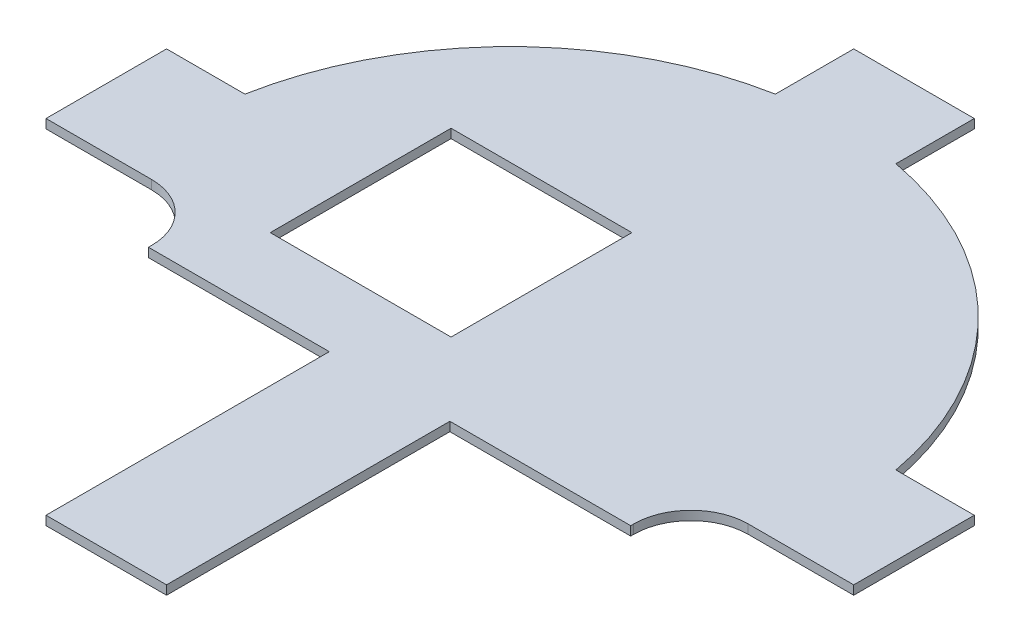
ISO-10303-21;
HEADER;
FILE_DESCRIPTION(('STEP AP214'),'2;1');
FILE_NAME('part.step','',(''),(''),'','','');
FILE_SCHEMA(('AUTOMOTIVE_DESIGN { 1 0 10303 214 1 1 1 1 }'));
ENDSEC;
DATA;
#1=APPLICATION_CONTEXT('core data for automotive mechanical design processes');
#2=APPLICATION_PROTOCOL_DEFINITION('international standard','automotive_design',2000,#1);
#3=PRODUCT_CONTEXT('',#1,'mechanical');
#4=PRODUCT('Part','Part','',(#3));
#5=PRODUCT_RELATED_PRODUCT_CATEGORY('part','',(#4));
#6=PRODUCT_DEFINITION_FORMATION('','',#4);
#7=PRODUCT_DEFINITION_CONTEXT('part definition',#1,'design');
#8=PRODUCT_DEFINITION('design','',#6,#7);
#9=PRODUCT_DEFINITION_SHAPE('','',#8);
#10=(LENGTH_UNIT() NAMED_UNIT(*) SI_UNIT(.MILLI.,.METRE.));
#11=(NAMED_UNIT(*) PLANE_ANGLE_UNIT() SI_UNIT($,.RADIAN.));
#12=(NAMED_UNIT(*) SI_UNIT($,.STERADIAN.) SOLID_ANGLE_UNIT());
#13=UNCERTAINTY_MEASURE_WITH_UNIT(LENGTH_MEASURE(1.E-05),#10,'distance_accuracy_value','');
#14=(GEOMETRIC_REPRESENTATION_CONTEXT(3) GLOBAL_UNCERTAINTY_ASSIGNED_CONTEXT((#13)) GLOBAL_UNIT_ASSIGNED_CONTEXT((#10,
#11,#12)) REPRESENTATION_CONTEXT('',''));
#15=CARTESIAN_POINT('',(0.,0.,0.));
#16=DIRECTION('',(0.,0.,1.));
#17=DIRECTION('',(1.,0.,0.));
#18=AXIS2_PLACEMENT_3D('',#15,#16,#17);
#19=CARTESIAN_POINT('',(-0.35449735449733,1.5,35.2134038800706));
#20=DIRECTION('',(0.,-1.,0.));
#21=DIRECTION('',(0.,0.,-1.));
#22=AXIS2_PLACEMENT_3D('',#19,#20,#21);
#23=CYLINDRICAL_SURFACE('',#22,54.9181208709839);
#24=CARTESIAN_POINT('',(-0.35449735449733,0.,35.2134038800706));
#25=DIRECTION('',(0.,1.,0.));
#26=DIRECTION('',(0.,0.,1.));
#27=AXIS2_PLACEMENT_3D('',#24,#25,#26);
#28=CIRCLE('',#27,54.9181208709839);
#29=CARTESIAN_POINT('',(9.64550264550266,0.,-18.7865961199294));
#30=VERTEX_POINT('',#29);
#31=CARTESIAN_POINT('',(53.6455026455027,0.,25.2134038800706));
#32=VERTEX_POINT('',#31);
#33=EDGE_CURVE('E227',#30,#32,#28,.F.);
#34=ORIENTED_EDGE('',*,*,#33,.F.);
#35=DIRECTION('',(0.,-1.,0.));
#36=VECTOR('',#35,1.);
#37=CARTESIAN_POINT('',(9.64550264550266,1.5,-18.7865961199294));
#38=LINE('',#37,#36);
#39=CARTESIAN_POINT('',(9.64550264550266,1.5,-18.7865961199294));
#40=VERTEX_POINT('',#39);
#41=EDGE_CURVE('E11',#40,#30,#38,.T.);
#42=ORIENTED_EDGE('',*,*,#41,.F.);
#43=CARTESIAN_POINT('',(-0.35449735449733,1.5,35.2134038800706));
#44=DIRECTION('',(0.,1.,0.));
#45=DIRECTION('',(0.,0.,1.));
#46=AXIS2_PLACEMENT_3D('',#43,#44,#45);
#47=CIRCLE('',#46,54.9181208709839);
#48=CARTESIAN_POINT('',(53.6455026455027,1.5,25.2134038800706));
#49=VERTEX_POINT('',#48);
#50=EDGE_CURVE('E231',#40,#49,#47,.F.);
#51=ORIENTED_EDGE('',*,*,#50,.T.);
#52=DIRECTION('',(0.,-1.,0.));
#53=VECTOR('',#52,1.);
#54=CARTESIAN_POINT('',(53.6455026455027,1.5,25.2134038800706));
#55=LINE('',#54,#53);
#56=EDGE_CURVE('E283',#49,#32,#55,.T.);
#57=ORIENTED_EDGE('',*,*,#56,.T.);
#58=EDGE_LOOP('',(#34,#42,#51,#57));
#59=FACE_BOUND('',#58,.T.);
#60=ADVANCED_FACE('F35',(#59),#23,.T.);
#61=CARTESIAN_POINT('',(9.64550264550266,1.5,0.));
#62=DIRECTION('',(1.,0.,0.));
#63=DIRECTION('',(0.,0.,-1.));
#64=AXIS2_PLACEMENT_3D('',#61,#62,#63);
#65=PLANE('',#64);
#66=DIRECTION('',(0.,0.,1.));
#67=VECTOR('',#66,1.);
#68=CARTESIAN_POINT('',(9.64550264550266,0.,0.));
#69=LINE('',#68,#67);
#70=CARTESIAN_POINT('',(9.64550264550266,0.,-31.7865961199294));
#71=VERTEX_POINT('',#70);
#72=EDGE_CURVE('E286',#71,#30,#69,.T.);
#73=ORIENTED_EDGE('',*,*,#72,.F.);
#74=DIRECTION('',(0.,-1.,0.));
#75=VECTOR('',#74,1.);
#76=CARTESIAN_POINT('',(9.64550264550266,1.5,-31.7865961199294));
#77=LINE('',#76,#75);
#78=CARTESIAN_POINT('',(9.64550264550266,1.5,-31.7865961199294));
#79=VERTEX_POINT('',#78);
#80=EDGE_CURVE('E42',#79,#71,#77,.T.);
#81=ORIENTED_EDGE('',*,*,#80,.F.);
#82=DIRECTION('',(0.,0.,1.));
#83=VECTOR('',#82,1.);
#84=CARTESIAN_POINT('',(9.64550264550266,1.5,0.));
#85=LINE('',#84,#83);
#86=EDGE_CURVE('E234',#79,#40,#85,.T.);
#87=ORIENTED_EDGE('',*,*,#86,.T.);
#88=ORIENTED_EDGE('',*,*,#41,.T.);
#89=EDGE_LOOP('',(#73,#81,#87,#88));
#90=FACE_BOUND('',#89,.T.);
#91=ADVANCED_FACE('F383',(#90),#65,.T.);
#92=CARTESIAN_POINT('',(0.,1.5,-31.7865961199294));
#93=DIRECTION('',(0.,0.,-1.));
#94=DIRECTION('',(-1.,0.,0.));
#95=AXIS2_PLACEMENT_3D('',#92,#93,#94);
#96=PLANE('',#95);
#97=DIRECTION('',(1.,0.,0.));
#98=VECTOR('',#97,1.);
#99=CARTESIAN_POINT('',(0.,0.,-31.7865961199294));
#100=LINE('',#99,#98);
#101=CARTESIAN_POINT('',(-10.3544973544973,0.,-31.7865961199294));
#102=VERTEX_POINT('',#101);
#103=EDGE_CURVE('E289',#102,#71,#100,.T.);
#104=ORIENTED_EDGE('',*,*,#103,.F.);
#105=DIRECTION('',(0.,-1.,0.));
#106=VECTOR('',#105,1.);
#107=CARTESIAN_POINT('',(-10.3544973544973,1.5,-31.7865961199294));
#108=LINE('',#107,#106);
#109=CARTESIAN_POINT('',(-10.3544973544973,1.5,-31.7865961199294));
#110=VERTEX_POINT('',#109);
#111=EDGE_CURVE('E375',#110,#102,#108,.T.);
#112=ORIENTED_EDGE('',*,*,#111,.F.);
#113=DIRECTION('',(1.,0.,0.));
#114=VECTOR('',#113,1.);
#115=CARTESIAN_POINT('',(0.,1.5,-31.7865961199294));
#116=LINE('',#115,#114);
#117=EDGE_CURVE('E238',#110,#79,#116,.T.);
#118=ORIENTED_EDGE('',*,*,#117,.T.);
#119=ORIENTED_EDGE('',*,*,#80,.T.);
#120=EDGE_LOOP('',(#104,#112,#118,#119));
#121=FACE_BOUND('',#120,.T.);
#122=ADVANCED_FACE('F379',(#121),#96,.T.);
#123=CARTESIAN_POINT('',(-10.3544973544973,1.5,0.));
#124=DIRECTION('',(1.,0.,0.));
#125=DIRECTION('',(0.,0.,-1.));
#126=AXIS2_PLACEMENT_3D('',#123,#124,#125);
#127=PLANE('',#126);
#128=DIRECTION('',(0.,0.,1.));
#129=VECTOR('',#128,1.);
#130=CARTESIAN_POINT('',(-10.3544973544973,0.,0.));
#131=LINE('',#130,#129);
#132=CARTESIAN_POINT('',(-10.3544973544973,0.,-18.7865961199294));
#133=VERTEX_POINT('',#132);
#134=EDGE_CURVE('E292',#102,#133,#131,.T.);
#135=ORIENTED_EDGE('',*,*,#134,.T.);
#136=DIRECTION('',(0.,-1.,0.));
#137=VECTOR('',#136,1.);
#138=CARTESIAN_POINT('',(-10.3544973544973,1.5,-18.7865961199294));
#139=LINE('',#138,#137);
#140=CARTESIAN_POINT('',(-10.3544973544973,1.5,-18.7865961199294));
#141=VERTEX_POINT('',#140);
#142=EDGE_CURVE('E373',#141,#133,#139,.T.);
#143=ORIENTED_EDGE('',*,*,#142,.F.);
#144=DIRECTION('',(0.,0.,1.));
#145=VECTOR('',#144,1.);
#146=CARTESIAN_POINT('',(-10.3544973544973,1.5,0.));
#147=LINE('',#146,#145);
#148=EDGE_CURVE('E241',#110,#141,#147,.T.);
#149=ORIENTED_EDGE('',*,*,#148,.F.);
#150=ORIENTED_EDGE('',*,*,#111,.T.);
#151=EDGE_LOOP('',(#135,#143,#149,#150));
#152=FACE_BOUND('',#151,.T.);
#153=ADVANCED_FACE('F389',(#152),#127,.F.);
#154=CARTESIAN_POINT('',(-0.35449735449733,1.5,35.2134038800706));
#155=DIRECTION('',(0.,-1.,0.));
#156=DIRECTION('',(0.,0.,-1.));
#157=AXIS2_PLACEMENT_3D('',#154,#155,#156);
#158=CYLINDRICAL_SURFACE('',#157,54.9181208709839);
#159=CARTESIAN_POINT('',(-0.35449735449733,0.,35.2134038800706));
#160=DIRECTION('',(0.,1.,0.));
#161=DIRECTION('',(0.,0.,1.));
#162=AXIS2_PLACEMENT_3D('',#159,#160,#161);
#163=CIRCLE('',#162,54.9181208709839);
#164=CARTESIAN_POINT('',(-54.3544973544973,0.,25.2134038800706));
#165=VERTEX_POINT('',#164);
#166=EDGE_CURVE('E295',#165,#133,#163,.F.);
#167=ORIENTED_EDGE('',*,*,#166,.F.);
#168=DIRECTION('',(0.,-1.,0.));
#169=VECTOR('',#168,1.);
#170=CARTESIAN_POINT('',(-54.3544973544973,1.5,25.2134038800706));
#171=LINE('',#170,#169);
#172=CARTESIAN_POINT('',(-54.3544973544973,1.5,25.2134038800706));
#173=VERTEX_POINT('',#172);
#174=EDGE_CURVE('E371',#173,#165,#171,.T.);
#175=ORIENTED_EDGE('',*,*,#174,.F.);
#176=CARTESIAN_POINT('',(-0.35449735449733,1.5,35.2134038800706));
#177=DIRECTION('',(0.,1.,0.));
#178=DIRECTION('',(0.,0.,1.));
#179=AXIS2_PLACEMENT_3D('',#176,#177,#178);
#180=CIRCLE('',#179,54.9181208709839);
#181=EDGE_CURVE('E243',#173,#141,#180,.F.);
#182=ORIENTED_EDGE('',*,*,#181,.T.);
#183=ORIENTED_EDGE('',*,*,#142,.T.);
#184=EDGE_LOOP('',(#167,#175,#182,#183));
#185=FACE_BOUND('',#184,.T.);
#186=ADVANCED_FACE('F463',(#185),#158,.T.);
#187=CARTESIAN_POINT('',(0.,1.5,25.2134038800706));
#188=DIRECTION('',(0.,0.,-1.));
#189=DIRECTION('',(-1.,0.,0.));
#190=AXIS2_PLACEMENT_3D('',#187,#188,#189);
#191=PLANE('',#190);
#192=DIRECTION('',(1.,0.,0.));
#193=VECTOR('',#192,1.);
#194=CARTESIAN_POINT('',(0.,0.,25.2134038800706));
#195=LINE('',#194,#193);
#196=CARTESIAN_POINT('',(-67.3544973544974,0.,25.2134038800706));
#197=VERTEX_POINT('',#196);
#198=EDGE_CURVE('E298',#197,#165,#195,.T.);
#199=ORIENTED_EDGE('',*,*,#198,.F.);
#200=DIRECTION('',(0.,-1.,0.));
#201=VECTOR('',#200,1.);
#202=CARTESIAN_POINT('',(-67.3544973544974,1.5,25.2134038800706));
#203=LINE('',#202,#201);
#204=CARTESIAN_POINT('',(-67.3544973544974,1.5,25.2134038800706));
#205=VERTEX_POINT('',#204);
#206=EDGE_CURVE('E369',#205,#197,#203,.T.);
#207=ORIENTED_EDGE('',*,*,#206,.F.);
#208=DIRECTION('',(1.,0.,0.));
#209=VECTOR('',#208,1.);
#210=CARTESIAN_POINT('',(0.,1.5,25.2134038800706));
#211=LINE('',#210,#209);
#212=EDGE_CURVE('E246',#205,#173,#211,.T.);
#213=ORIENTED_EDGE('',*,*,#212,.T.);
#214=ORIENTED_EDGE('',*,*,#174,.T.);
#215=EDGE_LOOP('',(#199,#207,#213,#214));
#216=FACE_BOUND('',#215,.T.);
#217=ADVANCED_FACE('F460',(#216),#191,.T.);
#218=CARTESIAN_POINT('',(-67.3544973544974,1.5,0.));
#219=DIRECTION('',(1.,0.,0.));
#220=DIRECTION('',(0.,0.,-1.));
#221=AXIS2_PLACEMENT_3D('',#218,#219,#220);
#222=PLANE('',#221);
#223=DIRECTION('',(0.,0.,1.));
#224=VECTOR('',#223,1.);
#225=CARTESIAN_POINT('',(-67.3544973544974,0.,0.));
#226=LINE('',#225,#224);
#227=CARTESIAN_POINT('',(-67.3544973544974,0.,45.2134038800706));
#228=VERTEX_POINT('',#227);
#229=EDGE_CURVE('E301',#197,#228,#226,.T.);
#230=ORIENTED_EDGE('',*,*,#229,.T.);
#231=DIRECTION('',(0.,-1.,0.));
#232=VECTOR('',#231,1.);
#233=CARTESIAN_POINT('',(-67.3544973544974,1.5,45.2134038800706));
#234=LINE('',#233,#232);
#235=CARTESIAN_POINT('',(-67.3544973544974,1.5,45.2134038800706));
#236=VERTEX_POINT('',#235);
#237=EDGE_CURVE('E367',#236,#228,#234,.T.);
#238=ORIENTED_EDGE('',*,*,#237,.F.);
#239=DIRECTION('',(0.,0.,1.));
#240=VECTOR('',#239,1.);
#241=CARTESIAN_POINT('',(-67.3544973544974,1.5,0.));
#242=LINE('',#241,#240);
#243=EDGE_CURVE('E249',#205,#236,#242,.T.);
#244=ORIENTED_EDGE('',*,*,#243,.F.);
#245=ORIENTED_EDGE('',*,*,#206,.T.);
#246=EDGE_LOOP('',(#230,#238,#244,#245));
#247=FACE_BOUND('',#246,.T.);
#248=ADVANCED_FACE('F457',(#247),#222,.F.);
#249=CARTESIAN_POINT('',(0.,1.5,45.2134038800706));
#250=DIRECTION('',(0.,0.,1.));
#251=DIRECTION('',(1.,0.,0.));
#252=AXIS2_PLACEMENT_3D('',#249,#250,#251);
#253=PLANE('',#252);
#254=DIRECTION('',(-1.,0.,0.));
#255=VECTOR('',#254,1.);
#256=CARTESIAN_POINT('',(0.,0.,45.2134038800706));
#257=LINE('',#256,#255);
#258=CARTESIAN_POINT('',(-49.8544973544974,0.,45.2134038800706));
#259=VERTEX_POINT('',#258);
#260=EDGE_CURVE('E304',#259,#228,#257,.T.);
#261=ORIENTED_EDGE('',*,*,#260,.F.);
#262=DIRECTION('',(0.,-1.,0.));
#263=VECTOR('',#262,1.);
#264=CARTESIAN_POINT('',(-49.8544973544974,1.5,45.2134038800706));
#265=LINE('',#264,#263);
#266=CARTESIAN_POINT('',(-49.8544973544974,1.5,45.2134038800706));
#267=VERTEX_POINT('',#266);
#268=EDGE_CURVE('E365',#267,#259,#265,.T.);
#269=ORIENTED_EDGE('',*,*,#268,.F.);
#270=DIRECTION('',(-1.,0.,0.));
#271=VECTOR('',#270,1.);
#272=CARTESIAN_POINT('',(0.,1.5,45.2134038800706));
#273=LINE('',#272,#271);
#274=EDGE_CURVE('E251',#267,#236,#273,.T.);
#275=ORIENTED_EDGE('',*,*,#274,.T.);
#276=ORIENTED_EDGE('',*,*,#237,.T.);
#277=EDGE_LOOP('',(#261,#269,#275,#276));
#278=FACE_BOUND('',#277,.T.);
#279=ADVANCED_FACE('F453',(#278),#253,.T.);
#280=CARTESIAN_POINT('',(-49.8544973544973,1.5,54.7134038800706));
#281=DIRECTION('',(0.,-1.,0.));
#282=DIRECTION('',(0.,0.,-1.));
#283=AXIS2_PLACEMENT_3D('',#280,#281,#282);
#284=CYLINDRICAL_SURFACE('',#283,9.5);
#285=CARTESIAN_POINT('',(-49.8544973544973,0.,54.7134038800706));
#286=DIRECTION('',(0.,1.,0.));
#287=DIRECTION('',(0.,0.,1.));
#288=AXIS2_PLACEMENT_3D('',#285,#286,#287);
#289=CIRCLE('',#288,9.5);
#290=CARTESIAN_POINT('',(-40.3544973544973,0.,54.7134038800706));
#291=VERTEX_POINT('',#290);
#292=EDGE_CURVE('E307',#291,#259,#289,.T.);
#293=ORIENTED_EDGE('',*,*,#292,.F.);
#294=DIRECTION('',(0.,-1.,0.));
#295=VECTOR('',#294,1.);
#296=CARTESIAN_POINT('',(-40.3544973544973,1.5,54.7134038800706));
#297=LINE('',#296,#295);
#298=CARTESIAN_POINT('',(-40.3544973544973,1.5,54.7134038800706));
#299=VERTEX_POINT('',#298);
#300=EDGE_CURVE('E363',#299,#291,#297,.T.);
#301=ORIENTED_EDGE('',*,*,#300,.F.);
#302=CARTESIAN_POINT('',(-49.8544973544973,1.5,54.7134038800706));
#303=DIRECTION('',(0.,1.,0.));
#304=DIRECTION('',(0.,0.,1.));
#305=AXIS2_PLACEMENT_3D('',#302,#303,#304);
#306=CIRCLE('',#305,9.5);
#307=EDGE_CURVE('E254',#299,#267,#306,.T.);
#308=ORIENTED_EDGE('',*,*,#307,.T.);
#309=ORIENTED_EDGE('',*,*,#268,.T.);
#310=EDGE_LOOP('',(#293,#301,#308,#309));
#311=FACE_BOUND('',#310,.T.);
#312=ADVANCED_FACE('F449',(#311),#284,.F.);
#313=CARTESIAN_POINT('',(-40.3544973544973,1.5,0.));
#314=DIRECTION('',(-1.,0.,0.));
#315=DIRECTION('',(0.,0.,1.));
#316=AXIS2_PLACEMENT_3D('',#313,#314,#315);
#317=PLANE('',#316);
#318=DIRECTION('',(0.,0.,-1.));
#319=VECTOR('',#318,1.);
#320=CARTESIAN_POINT('',(-40.3544973544973,0.,0.));
#321=LINE('',#320,#319);
#322=CARTESIAN_POINT('',(-40.3544973544973,0.,55.2134038800706));
#323=VERTEX_POINT('',#322);
#324=EDGE_CURVE('E310',#323,#291,#321,.T.);
#325=ORIENTED_EDGE('',*,*,#324,.F.);
#326=DIRECTION('',(0.,-1.,0.));
#327=VECTOR('',#326,1.);
#328=CARTESIAN_POINT('',(-40.3544973544973,1.5,55.2134038800706));
#329=LINE('',#328,#327);
#330=CARTESIAN_POINT('',(-40.3544973544973,1.5,55.2134038800706));
#331=VERTEX_POINT('',#330);
#332=EDGE_CURVE('E361',#331,#323,#329,.T.);
#333=ORIENTED_EDGE('',*,*,#332,.F.);
#334=DIRECTION('',(0.,0.,-1.));
#335=VECTOR('',#334,1.);
#336=CARTESIAN_POINT('',(-40.3544973544973,1.5,0.));
#337=LINE('',#336,#335);
#338=EDGE_CURVE('E257',#331,#299,#337,.T.);
#339=ORIENTED_EDGE('',*,*,#338,.T.);
#340=ORIENTED_EDGE('',*,*,#300,.T.);
#341=EDGE_LOOP('',(#325,#333,#339,#340));
#342=FACE_BOUND('',#341,.T.);
#343=ADVANCED_FACE('F444',(#342),#317,.T.);
#344=CARTESIAN_POINT('',(0.,1.5,55.2134038800706));
#345=DIRECTION('',(0.,0.,1.));
#346=DIRECTION('',(1.,0.,0.));
#347=AXIS2_PLACEMENT_3D('',#344,#345,#346);
#348=PLANE('',#347);
#349=DIRECTION('',(-1.,0.,0.));
#350=VECTOR('',#349,1.);
#351=CARTESIAN_POINT('',(0.,0.,55.2134038800706));
#352=LINE('',#351,#350);
#353=CARTESIAN_POINT('',(-10.3544973544973,0.,55.2134038800706));
#354=VERTEX_POINT('',#353);
#355=EDGE_CURVE('E313',#354,#323,#352,.T.);
#356=ORIENTED_EDGE('',*,*,#355,.F.);
#357=DIRECTION('',(0.,-1.,0.));
#358=VECTOR('',#357,1.);
#359=CARTESIAN_POINT('',(-10.3544973544973,1.5,55.2134038800706));
#360=LINE('',#359,#358);
#361=CARTESIAN_POINT('',(-10.3544973544973,1.5,55.2134038800706));
#362=VERTEX_POINT('',#361);
#363=EDGE_CURVE('E359',#362,#354,#360,.T.);
#364=ORIENTED_EDGE('',*,*,#363,.F.);
#365=DIRECTION('',(-1.,0.,0.));
#366=VECTOR('',#365,1.);
#367=CARTESIAN_POINT('',(0.,1.5,55.2134038800706));
#368=LINE('',#367,#366);
#369=EDGE_CURVE('E260',#362,#331,#368,.T.);
#370=ORIENTED_EDGE('',*,*,#369,.T.);
#371=ORIENTED_EDGE('',*,*,#332,.T.);
#372=EDGE_LOOP('',(#356,#364,#370,#371));
#373=FACE_BOUND('',#372,.T.);
#374=ADVANCED_FACE('F438',(#373),#348,.T.);
#375=CARTESIAN_POINT('',(-10.3544973544973,1.5,0.));
#376=DIRECTION('',(1.,0.,0.));
#377=DIRECTION('',(0.,0.,-1.));
#378=AXIS2_PLACEMENT_3D('',#375,#376,#377);
#379=PLANE('',#378);
#380=DIRECTION('',(0.,0.,1.));
#381=VECTOR('',#380,1.);
#382=CARTESIAN_POINT('',(-10.3544973544973,0.,0.));
#383=LINE('',#382,#381);
#384=CARTESIAN_POINT('',(-10.3544973544973,0.,102.213403880071));
#385=VERTEX_POINT('',#384);
#386=EDGE_CURVE('E316',#354,#385,#383,.T.);
#387=ORIENTED_EDGE('',*,*,#386,.T.);
#388=DIRECTION('',(0.,-1.,0.));
#389=VECTOR('',#388,1.);
#390=CARTESIAN_POINT('',(-10.3544973544973,1.5,102.213403880071));
#391=LINE('',#390,#389);
#392=CARTESIAN_POINT('',(-10.3544973544973,1.5,102.213403880071));
#393=VERTEX_POINT('',#392);
#394=EDGE_CURVE('E356',#393,#385,#391,.T.);
#395=ORIENTED_EDGE('',*,*,#394,.F.);
#396=DIRECTION('',(0.,0.,1.));
#397=VECTOR('',#396,1.);
#398=CARTESIAN_POINT('',(-10.3544973544973,1.5,0.));
#399=LINE('',#398,#397);
#400=EDGE_CURVE('E263',#362,#393,#399,.T.);
#401=ORIENTED_EDGE('',*,*,#400,.F.);
#402=ORIENTED_EDGE('',*,*,#363,.T.);
#403=EDGE_LOOP('',(#387,#395,#401,#402));
#404=FACE_BOUND('',#403,.T.);
#405=ADVANCED_FACE('F464',(#404),#379,.F.);
#406=CARTESIAN_POINT('',(0.,1.5,102.213403880071));
#407=DIRECTION('',(0.,0.,-1.));
#408=DIRECTION('',(-1.,0.,0.));
#409=AXIS2_PLACEMENT_3D('',#406,#407,#408);
#410=PLANE('',#409);
#411=DIRECTION('',(1.,0.,0.));
#412=VECTOR('',#411,1.);
#413=CARTESIAN_POINT('',(0.,0.,102.213403880071));
#414=LINE('',#413,#412);
#415=CARTESIAN_POINT('',(9.64550264550266,0.,102.213403880071));
#416=VERTEX_POINT('',#415);
#417=EDGE_CURVE('E318',#385,#416,#414,.T.);
#418=ORIENTED_EDGE('',*,*,#417,.T.);
#419=DIRECTION('',(0.,-1.,0.));
#420=VECTOR('',#419,1.);
#421=CARTESIAN_POINT('',(9.64550264550266,1.5,102.213403880071));
#422=LINE('',#421,#420);
#423=CARTESIAN_POINT('',(9.64550264550266,1.5,102.213403880071));
#424=VERTEX_POINT('',#423);
#425=EDGE_CURVE('E354',#424,#416,#422,.T.);
#426=ORIENTED_EDGE('',*,*,#425,.F.);
#427=DIRECTION('',(1.,0.,0.));
#428=VECTOR('',#427,1.);
#429=CARTESIAN_POINT('',(0.,1.5,102.213403880071));
#430=LINE('',#429,#428);
#431=EDGE_CURVE('E265',#393,#424,#430,.T.);
#432=ORIENTED_EDGE('',*,*,#431,.F.);
#433=ORIENTED_EDGE('',*,*,#394,.T.);
#434=EDGE_LOOP('',(#418,#426,#432,#433));
#435=FACE_BOUND('',#434,.T.);
#436=ADVANCED_FACE('F432',(#435),#410,.F.);
#437=CARTESIAN_POINT('',(9.64550264550266,1.5,0.));
#438=DIRECTION('',(1.,0.,0.));
#439=DIRECTION('',(0.,0.,-1.));
#440=AXIS2_PLACEMENT_3D('',#437,#438,#439);
#441=PLANE('',#440);
#442=DIRECTION('',(0.,0.,1.));
#443=VECTOR('',#442,1.);
#444=CARTESIAN_POINT('',(9.64550264550266,0.,0.));
#445=LINE('',#444,#443);
#446=CARTESIAN_POINT('',(9.64550264550266,0.,55.2134038800706));
#447=VERTEX_POINT('',#446);
#448=EDGE_CURVE('E321',#447,#416,#445,.T.);
#449=ORIENTED_EDGE('',*,*,#448,.F.);
#450=DIRECTION('',(0.,-1.,0.));
#451=VECTOR('',#450,1.);
#452=CARTESIAN_POINT('',(9.64550264550266,1.5,55.2134038800706));
#453=LINE('',#452,#451);
#454=CARTESIAN_POINT('',(9.64550264550266,1.5,55.2134038800706));
#455=VERTEX_POINT('',#454);
#456=EDGE_CURVE('E352',#455,#447,#453,.T.);
#457=ORIENTED_EDGE('',*,*,#456,.F.);
#458=DIRECTION('',(0.,0.,1.));
#459=VECTOR('',#458,1.);
#460=CARTESIAN_POINT('',(9.64550264550266,1.5,0.));
#461=LINE('',#460,#459);
#462=EDGE_CURVE('E267',#455,#424,#461,.T.);
#463=ORIENTED_EDGE('',*,*,#462,.T.);
#464=ORIENTED_EDGE('',*,*,#425,.T.);
#465=EDGE_LOOP('',(#449,#457,#463,#464));
#466=FACE_BOUND('',#465,.T.);
#467=ADVANCED_FACE('F428',(#466),#441,.T.);
#468=CARTESIAN_POINT('',(0.,1.5,55.2134038800706));
#469=DIRECTION('',(0.,0.,-1.));
#470=DIRECTION('',(-1.,0.,0.));
#471=AXIS2_PLACEMENT_3D('',#468,#469,#470);
#472=PLANE('',#471);
#473=DIRECTION('',(1.,0.,0.));
#474=VECTOR('',#473,1.);
#475=CARTESIAN_POINT('',(0.,0.,55.2134038800706));
#476=LINE('',#475,#474);
#477=CARTESIAN_POINT('',(39.6455026455027,0.,55.2134038800706));
#478=VERTEX_POINT('',#477);
#479=EDGE_CURVE('E324',#447,#478,#476,.T.);
#480=ORIENTED_EDGE('',*,*,#479,.T.);
#481=DIRECTION('',(0.,-1.,0.));
#482=VECTOR('',#481,1.);
#483=CARTESIAN_POINT('',(39.6455026455027,1.5,55.2134038800706));
#484=LINE('',#483,#482);
#485=CARTESIAN_POINT('',(39.6455026455027,1.5,55.2134038800706));
#486=VERTEX_POINT('',#485);
#487=EDGE_CURVE('E349',#486,#478,#484,.T.);
#488=ORIENTED_EDGE('',*,*,#487,.F.);
#489=DIRECTION('',(1.,0.,0.));
#490=VECTOR('',#489,1.);
#491=CARTESIAN_POINT('',(0.,1.5,55.2134038800706));
#492=LINE('',#491,#490);
#493=EDGE_CURVE('E270',#455,#486,#492,.T.);
#494=ORIENTED_EDGE('',*,*,#493,.F.);
#495=ORIENTED_EDGE('',*,*,#456,.T.);
#496=EDGE_LOOP('',(#480,#488,#494,#495));
#497=FACE_BOUND('',#496,.T.);
#498=ADVANCED_FACE('F423',(#497),#472,.F.);
#499=CARTESIAN_POINT('',(39.6455026455027,1.5,0.));
#500=DIRECTION('',(-1.,0.,0.));
#501=DIRECTION('',(0.,0.,1.));
#502=AXIS2_PLACEMENT_3D('',#499,#500,#501);
#503=PLANE('',#502);
#504=DIRECTION('',(0.,0.,-1.));
#505=VECTOR('',#504,1.);
#506=CARTESIAN_POINT('',(39.6455026455027,0.,0.));
#507=LINE('',#506,#505);
#508=CARTESIAN_POINT('',(39.6455026455027,0.,54.7134038800706));
#509=VERTEX_POINT('',#508);
#510=EDGE_CURVE('E326',#478,#509,#507,.T.);
#511=ORIENTED_EDGE('',*,*,#510,.T.);
#512=DIRECTION('',(0.,-1.,0.));
#513=VECTOR('',#512,1.);
#514=CARTESIAN_POINT('',(39.6455026455027,1.5,54.7134038800706));
#515=LINE('',#514,#513);
#516=CARTESIAN_POINT('',(39.6455026455027,1.5,54.7134038800706));
#517=VERTEX_POINT('',#516);
#518=EDGE_CURVE('E346',#517,#509,#515,.T.);
#519=ORIENTED_EDGE('',*,*,#518,.F.);
#520=DIRECTION('',(0.,0.,-1.));
#521=VECTOR('',#520,1.);
#522=CARTESIAN_POINT('',(39.6455026455027,1.5,0.));
#523=LINE('',#522,#521);
#524=EDGE_CURVE('E272',#486,#517,#523,.T.);
#525=ORIENTED_EDGE('',*,*,#524,.F.);
#526=ORIENTED_EDGE('',*,*,#487,.T.);
#527=EDGE_LOOP('',(#511,#519,#525,#526));
#528=FACE_BOUND('',#527,.T.);
#529=ADVANCED_FACE('F419',(#528),#503,.F.);
#530=CARTESIAN_POINT('',(49.1455026455027,1.5,54.7134038800706));
#531=DIRECTION('',(0.,-1.,0.));
#532=DIRECTION('',(0.,0.,-1.));
#533=AXIS2_PLACEMENT_3D('',#530,#531,#532);
#534=CYLINDRICAL_SURFACE('',#533,9.5);
#535=CARTESIAN_POINT('',(49.1455026455027,0.,54.7134038800706));
#536=DIRECTION('',(0.,1.,0.));
#537=DIRECTION('',(0.,0.,1.));
#538=AXIS2_PLACEMENT_3D('',#535,#536,#537);
#539=CIRCLE('',#538,9.5);
#540=CARTESIAN_POINT('',(49.1455026455027,0.,45.2134038800706));
#541=VERTEX_POINT('',#540);
#542=EDGE_CURVE('E328',#509,#541,#539,.F.);
#543=ORIENTED_EDGE('',*,*,#542,.T.);
#544=DIRECTION('',(0.,-1.,0.));
#545=VECTOR('',#544,1.);
#546=CARTESIAN_POINT('',(49.1455026455027,1.5,45.2134038800706));
#547=LINE('',#546,#545);
#548=CARTESIAN_POINT('',(49.1455026455027,1.5,45.2134038800706));
#549=VERTEX_POINT('',#548);
#550=EDGE_CURVE('E343',#549,#541,#547,.T.);
#551=ORIENTED_EDGE('',*,*,#550,.F.);
#552=CARTESIAN_POINT('',(49.1455026455027,1.5,54.7134038800706));
#553=DIRECTION('',(0.,1.,0.));
#554=DIRECTION('',(0.,0.,1.));
#555=AXIS2_PLACEMENT_3D('',#552,#553,#554);
#556=CIRCLE('',#555,9.5);
#557=EDGE_CURVE('E274',#517,#549,#556,.F.);
#558=ORIENTED_EDGE('',*,*,#557,.F.);
#559=ORIENTED_EDGE('',*,*,#518,.T.);
#560=EDGE_LOOP('',(#543,#551,#558,#559));
#561=FACE_BOUND('',#560,.T.);
#562=ADVANCED_FACE('F414',(#561),#534,.F.);
#563=CARTESIAN_POINT('',(0.,1.5,45.2134038800706));
#564=DIRECTION('',(0.,0.,-1.));
#565=DIRECTION('',(-1.,0.,0.));
#566=AXIS2_PLACEMENT_3D('',#563,#564,#565);
#567=PLANE('',#566);
#568=DIRECTION('',(1.,0.,0.));
#569=VECTOR('',#568,1.);
#570=CARTESIAN_POINT('',(0.,0.,45.2134038800706));
#571=LINE('',#570,#569);
#572=CARTESIAN_POINT('',(66.6455026455027,0.,45.2134038800706));
#573=VERTEX_POINT('',#572);
#574=EDGE_CURVE('E330',#541,#573,#571,.T.);
#575=ORIENTED_EDGE('',*,*,#574,.T.);
#576=DIRECTION('',(0.,-1.,0.));
#577=VECTOR('',#576,1.);
#578=CARTESIAN_POINT('',(66.6455026455027,1.5,45.2134038800706));
#579=LINE('',#578,#577);
#580=CARTESIAN_POINT('',(66.6455026455027,1.5,45.2134038800706));
#581=VERTEX_POINT('',#580);
#582=EDGE_CURVE('E341',#581,#573,#579,.T.);
#583=ORIENTED_EDGE('',*,*,#582,.F.);
#584=DIRECTION('',(1.,0.,0.));
#585=VECTOR('',#584,1.);
#586=CARTESIAN_POINT('',(0.,1.5,45.2134038800706));
#587=LINE('',#586,#585);
#588=EDGE_CURVE('E276',#549,#581,#587,.T.);
#589=ORIENTED_EDGE('',*,*,#588,.F.);
#590=ORIENTED_EDGE('',*,*,#550,.T.);
#591=EDGE_LOOP('',(#575,#583,#589,#590));
#592=FACE_BOUND('',#591,.T.);
#593=ADVANCED_FACE('F408',(#592),#567,.F.);
#594=CARTESIAN_POINT('',(66.6455026455027,1.5,0.));
#595=DIRECTION('',(1.,0.,0.));
#596=DIRECTION('',(0.,0.,-1.));
#597=AXIS2_PLACEMENT_3D('',#594,#595,#596);
#598=PLANE('',#597);
#599=DIRECTION('',(0.,0.,1.));
#600=VECTOR('',#599,1.);
#601=CARTESIAN_POINT('',(66.6455026455027,0.,0.));
#602=LINE('',#601,#600);
#603=CARTESIAN_POINT('',(66.6455026455027,0.,25.2134038800706));
#604=VERTEX_POINT('',#603);
#605=EDGE_CURVE('E333',#604,#573,#602,.T.);
#606=ORIENTED_EDGE('',*,*,#605,.F.);
#607=DIRECTION('',(0.,-1.,0.));
#608=VECTOR('',#607,1.);
#609=CARTESIAN_POINT('',(66.6455026455027,1.5,25.2134038800706));
#610=LINE('',#609,#608);
#611=CARTESIAN_POINT('',(66.6455026455027,1.5,25.2134038800706));
#612=VERTEX_POINT('',#611);
#613=EDGE_CURVE('E339',#612,#604,#610,.T.);
#614=ORIENTED_EDGE('',*,*,#613,.F.);
#615=DIRECTION('',(0.,0.,1.));
#616=VECTOR('',#615,1.);
#617=CARTESIAN_POINT('',(66.6455026455027,1.5,0.));
#618=LINE('',#617,#616);
#619=EDGE_CURVE('E278',#612,#581,#618,.T.);
#620=ORIENTED_EDGE('',*,*,#619,.T.);
#621=ORIENTED_EDGE('',*,*,#582,.T.);
#622=EDGE_LOOP('',(#606,#614,#620,#621));
#623=FACE_BOUND('',#622,.T.);
#624=ADVANCED_FACE('F404',(#623),#598,.T.);
#625=CARTESIAN_POINT('',(0.,1.5,25.2134038800706));
#626=DIRECTION('',(0.,0.,1.));
#627=DIRECTION('',(1.,0.,0.));
#628=AXIS2_PLACEMENT_3D('',#625,#626,#627);
#629=PLANE('',#628);
#630=DIRECTION('',(-1.,0.,0.));
#631=VECTOR('',#630,1.);
#632=CARTESIAN_POINT('',(0.,0.,25.2134038800706));
#633=LINE('',#632,#631);
#634=EDGE_CURVE('E235',#604,#32,#633,.T.);
#635=ORIENTED_EDGE('',*,*,#634,.T.);
#636=ORIENTED_EDGE('',*,*,#56,.F.);
#637=DIRECTION('',(-1.,0.,0.));
#638=VECTOR('',#637,1.);
#639=CARTESIAN_POINT('',(0.,1.5,25.2134038800706));
#640=LINE('',#639,#638);
#641=EDGE_CURVE('E281',#612,#49,#640,.T.);
#642=ORIENTED_EDGE('',*,*,#641,.F.);
#643=ORIENTED_EDGE('',*,*,#613,.T.);
#644=EDGE_LOOP('',(#635,#636,#642,#643));
#645=FACE_BOUND('',#644,.T.);
#646=ADVANCED_FACE('F562',(#645),#629,.F.);
#647=CARTESIAN_POINT('',(0.,1.5,0.));
#648=DIRECTION('',(0.,1.,0.));
#649=DIRECTION('',(0.,0.,1.));
#650=AXIS2_PLACEMENT_3D('',#647,#648,#649);
#651=PLANE('',#650);
#652=DIRECTION('',(0.,0.,1.));
#653=VECTOR('',#652,1.);
#654=CARTESIAN_POINT('',(-32.3544973544973,1.5,43.0134038800705));
#655=LINE('',#654,#653);
#656=CARTESIAN_POINT('',(-32.3544973544973,1.5,13.0134038800706));
#657=VERTEX_POINT('',#656);
#658=CARTESIAN_POINT('',(-32.3544973544973,1.5,43.0134038800705));
#659=VERTEX_POINT('',#658);
#660=EDGE_CURVE('E49',#657,#659,#655,.T.);
#661=ORIENTED_EDGE('',*,*,#660,.F.);
#662=DIRECTION('',(-1.,0.,0.));
#663=VECTOR('',#662,1.);
#664=CARTESIAN_POINT('',(-32.3544973544973,1.5,13.0134038800706));
#665=LINE('',#664,#663);
#666=CARTESIAN_POINT('',(-2.35449735449735,1.5,13.0134038800706));
#667=VERTEX_POINT('',#666);
#668=EDGE_CURVE('E212',#667,#657,#665,.T.);
#669=ORIENTED_EDGE('',*,*,#668,.F.);
#670=DIRECTION('',(0.,0.,-1.));
#671=VECTOR('',#670,1.);
#672=CARTESIAN_POINT('',(-2.35449735449735,1.5,43.0134038800705));
#673=LINE('',#672,#671);
#674=CARTESIAN_POINT('',(-2.35449735449735,1.5,43.0134038800705));
#675=VERTEX_POINT('',#674);
#676=EDGE_CURVE('E215',#675,#667,#673,.T.);
#677=ORIENTED_EDGE('',*,*,#676,.F.);
#678=DIRECTION('',(1.,0.,0.));
#679=VECTOR('',#678,1.);
#680=CARTESIAN_POINT('',(-32.3544973544973,1.5,43.0134038800705));
#681=LINE('',#680,#679);
#682=EDGE_CURVE('E221',#659,#675,#681,.T.);
#683=ORIENTED_EDGE('',*,*,#682,.F.);
#684=EDGE_LOOP('',(#661,#669,#677,#683));
#685=FACE_BOUND('',#684,.T.);
#686=ORIENTED_EDGE('',*,*,#50,.F.);
#687=ORIENTED_EDGE('',*,*,#86,.F.);
#688=ORIENTED_EDGE('',*,*,#117,.F.);
#689=ORIENTED_EDGE('',*,*,#148,.T.);
#690=ORIENTED_EDGE('',*,*,#181,.F.);
#691=ORIENTED_EDGE('',*,*,#212,.F.);
#692=ORIENTED_EDGE('',*,*,#243,.T.);
#693=ORIENTED_EDGE('',*,*,#274,.F.);
#694=ORIENTED_EDGE('',*,*,#307,.F.);
#695=ORIENTED_EDGE('',*,*,#338,.F.);
#696=ORIENTED_EDGE('',*,*,#369,.F.);
#697=ORIENTED_EDGE('',*,*,#400,.T.);
#698=ORIENTED_EDGE('',*,*,#431,.T.);
#699=ORIENTED_EDGE('',*,*,#462,.F.);
#700=ORIENTED_EDGE('',*,*,#493,.T.);
#701=ORIENTED_EDGE('',*,*,#524,.T.);
#702=ORIENTED_EDGE('',*,*,#557,.T.);
#703=ORIENTED_EDGE('',*,*,#588,.T.);
#704=ORIENTED_EDGE('',*,*,#619,.F.);
#705=ORIENTED_EDGE('',*,*,#641,.T.);
#706=EDGE_LOOP('',(#686,#687,#688,#689,#690,#691,#692,#693,#694,#695,#696,#697,#698,#699,#700,
#701,#702,#703,#704,#705));
#707=FACE_BOUND('',#706,.T.);
#708=ADVANCED_FACE('F394',(#685,#707),#651,.T.);
#709=CARTESIAN_POINT('',(0.,0.,0.));
#710=DIRECTION('',(0.,1.,0.));
#711=DIRECTION('',(0.,0.,1.));
#712=AXIS2_PLACEMENT_3D('',#709,#710,#711);
#713=PLANE('',#712);
#714=DIRECTION('',(-1.,0.,0.));
#715=VECTOR('',#714,1.);
#716=CARTESIAN_POINT('',(-32.3544973544973,0.,13.0134038800706));
#717=LINE('',#716,#715);
#718=CARTESIAN_POINT('',(-2.35449735449735,0.,13.0134038800706));
#719=VERTEX_POINT('',#718);
#720=CARTESIAN_POINT('',(-32.3544973544973,0.,13.0134038800706));
#721=VERTEX_POINT('',#720);
#722=EDGE_CURVE('E202',#719,#721,#717,.T.);
#723=ORIENTED_EDGE('',*,*,#722,.T.);
#724=DIRECTION('',(0.,0.,1.));
#725=VECTOR('',#724,1.);
#726=CARTESIAN_POINT('',(-32.3544973544973,0.,43.0134038800705));
#727=LINE('',#726,#725);
#728=CARTESIAN_POINT('',(-32.3544973544973,0.,43.0134038800705));
#729=VERTEX_POINT('',#728);
#730=EDGE_CURVE('E196',#721,#729,#727,.T.);
#731=ORIENTED_EDGE('',*,*,#730,.T.);
#732=DIRECTION('',(1.,0.,0.));
#733=VECTOR('',#732,1.);
#734=CARTESIAN_POINT('',(-32.3544973544973,0.,43.0134038800705));
#735=LINE('',#734,#733);
#736=CARTESIAN_POINT('',(-2.35449735449735,0.,43.0134038800705));
#737=VERTEX_POINT('',#736);
#738=EDGE_CURVE('E205',#729,#737,#735,.T.);
#739=ORIENTED_EDGE('',*,*,#738,.T.);
#740=DIRECTION('',(0.,0.,-1.));
#741=VECTOR('',#740,1.);
#742=CARTESIAN_POINT('',(-2.35449735449735,0.,43.0134038800705));
#743=LINE('',#742,#741);
#744=EDGE_CURVE('E57',#737,#719,#743,.T.);
#745=ORIENTED_EDGE('',*,*,#744,.T.);
#746=EDGE_LOOP('',(#723,#731,#739,#745));
#747=FACE_BOUND('',#746,.T.);
#748=ORIENTED_EDGE('',*,*,#33,.T.);
#749=ORIENTED_EDGE('',*,*,#634,.F.);
#750=ORIENTED_EDGE('',*,*,#605,.T.);
#751=ORIENTED_EDGE('',*,*,#574,.F.);
#752=ORIENTED_EDGE('',*,*,#542,.F.);
#753=ORIENTED_EDGE('',*,*,#510,.F.);
#754=ORIENTED_EDGE('',*,*,#479,.F.);
#755=ORIENTED_EDGE('',*,*,#448,.T.);
#756=ORIENTED_EDGE('',*,*,#417,.F.);
#757=ORIENTED_EDGE('',*,*,#386,.F.);
#758=ORIENTED_EDGE('',*,*,#355,.T.);
#759=ORIENTED_EDGE('',*,*,#324,.T.);
#760=ORIENTED_EDGE('',*,*,#292,.T.);
#761=ORIENTED_EDGE('',*,*,#260,.T.);
#762=ORIENTED_EDGE('',*,*,#229,.F.);
#763=ORIENTED_EDGE('',*,*,#198,.T.);
#764=ORIENTED_EDGE('',*,*,#166,.T.);
#765=ORIENTED_EDGE('',*,*,#134,.F.);
#766=ORIENTED_EDGE('',*,*,#103,.T.);
#767=ORIENTED_EDGE('',*,*,#72,.T.);
#768=EDGE_LOOP('',(#748,#749,#750,#751,#752,#753,#754,#755,#756,#757,#758,#759,#760,#761,#762,
#763,#764,#765,#766,#767));
#769=FACE_BOUND('',#768,.T.);
#770=ADVANCED_FACE('F209',(#747,#769),#713,.F.);
#771=CARTESIAN_POINT('',(-32.3544973544973,0.,43.0134038800705));
#772=DIRECTION('',(-1.,0.,0.));
#773=DIRECTION('',(0.,0.,1.));
#774=AXIS2_PLACEMENT_3D('',#771,#772,#773);
#775=PLANE('',#774);
#776=ORIENTED_EDGE('',*,*,#660,.T.);
#777=DIRECTION('',(0.,1.,0.));
#778=VECTOR('',#777,1.);
#779=CARTESIAN_POINT('',(-32.3544973544973,0.,43.0134038800705));
#780=LINE('',#779,#778);
#781=EDGE_CURVE('E192',#729,#659,#780,.T.);
#782=ORIENTED_EDGE('',*,*,#781,.F.);
#783=ORIENTED_EDGE('',*,*,#730,.F.);
#784=DIRECTION('',(0.,1.,0.));
#785=VECTOR('',#784,1.);
#786=CARTESIAN_POINT('',(-32.3544973544973,0.,13.0134038800706));
#787=LINE('',#786,#785);
#788=EDGE_CURVE('E225',#721,#657,#787,.T.);
#789=ORIENTED_EDGE('',*,*,#788,.T.);
#790=EDGE_LOOP('',(#776,#782,#783,#789));
#791=FACE_BOUND('',#790,.T.);
#792=ADVANCED_FACE('F194',(#791),#775,.F.);
#793=CARTESIAN_POINT('',(-32.3544973544973,0.,13.0134038800706));
#794=DIRECTION('',(0.,0.,-1.));
#795=DIRECTION('',(-1.,0.,0.));
#796=AXIS2_PLACEMENT_3D('',#793,#794,#795);
#797=PLANE('',#796);
#798=ORIENTED_EDGE('',*,*,#668,.T.);
#799=ORIENTED_EDGE('',*,*,#788,.F.);
#800=ORIENTED_EDGE('',*,*,#722,.F.);
#801=DIRECTION('',(0.,1.,0.));
#802=VECTOR('',#801,1.);
#803=CARTESIAN_POINT('',(-2.35449735449735,0.,13.0134038800706));
#804=LINE('',#803,#802);
#805=EDGE_CURVE('E228',#719,#667,#804,.T.);
#806=ORIENTED_EDGE('',*,*,#805,.T.);
#807=EDGE_LOOP('',(#798,#799,#800,#806));
#808=FACE_BOUND('',#807,.T.);
#809=ADVANCED_FACE('F601',(#808),#797,.F.);
#810=CARTESIAN_POINT('',(-2.35449735449735,0.,43.0134038800705));
#811=DIRECTION('',(1.,0.,0.));
#812=DIRECTION('',(0.,0.,-1.));
#813=AXIS2_PLACEMENT_3D('',#810,#811,#812);
#814=PLANE('',#813);
#815=ORIENTED_EDGE('',*,*,#676,.T.);
#816=ORIENTED_EDGE('',*,*,#805,.F.);
#817=ORIENTED_EDGE('',*,*,#744,.F.);
#818=DIRECTION('',(0.,1.,0.));
#819=VECTOR('',#818,1.);
#820=CARTESIAN_POINT('',(-2.35449735449735,0.,43.0134038800705));
#821=LINE('',#820,#819);
#822=EDGE_CURVE('E201',#737,#675,#821,.T.);
#823=ORIENTED_EDGE('',*,*,#822,.T.);
#824=EDGE_LOOP('',(#815,#816,#817,#823));
#825=FACE_BOUND('',#824,.T.);
#826=ADVANCED_FACE('F610',(#825),#814,.F.);
#827=CARTESIAN_POINT('',(-32.3544973544973,0.,43.0134038800705));
#828=DIRECTION('',(0.,0.,1.));
#829=DIRECTION('',(1.,0.,0.));
#830=AXIS2_PLACEMENT_3D('',#827,#828,#829);
#831=PLANE('',#830);
#832=ORIENTED_EDGE('',*,*,#682,.T.);
#833=ORIENTED_EDGE('',*,*,#822,.F.);
#834=ORIENTED_EDGE('',*,*,#738,.F.);
#835=ORIENTED_EDGE('',*,*,#781,.T.);
#836=EDGE_LOOP('',(#832,#833,#834,#835));
#837=FACE_BOUND('',#836,.T.);
#838=ADVANCED_FACE('F206',(#837),#831,.F.);
#839=CLOSED_SHELL('',(#60,#91,#122,#153,#186,#217,#248,#279,#312,#343,#374,#405,#436,#467,#498,
#529,#562,#593,#624,#646,#708,#770,#792,#809,#826,#838));
#840=MANIFOLD_SOLID_BREP('B2',#839);
#841=ADVANCED_BREP_SHAPE_REPRESENTATION('',(#18,#840),#14);
#842=SHAPE_DEFINITION_REPRESENTATION(#9,#841);
ENDSEC;
END-ISO-10303-21;
